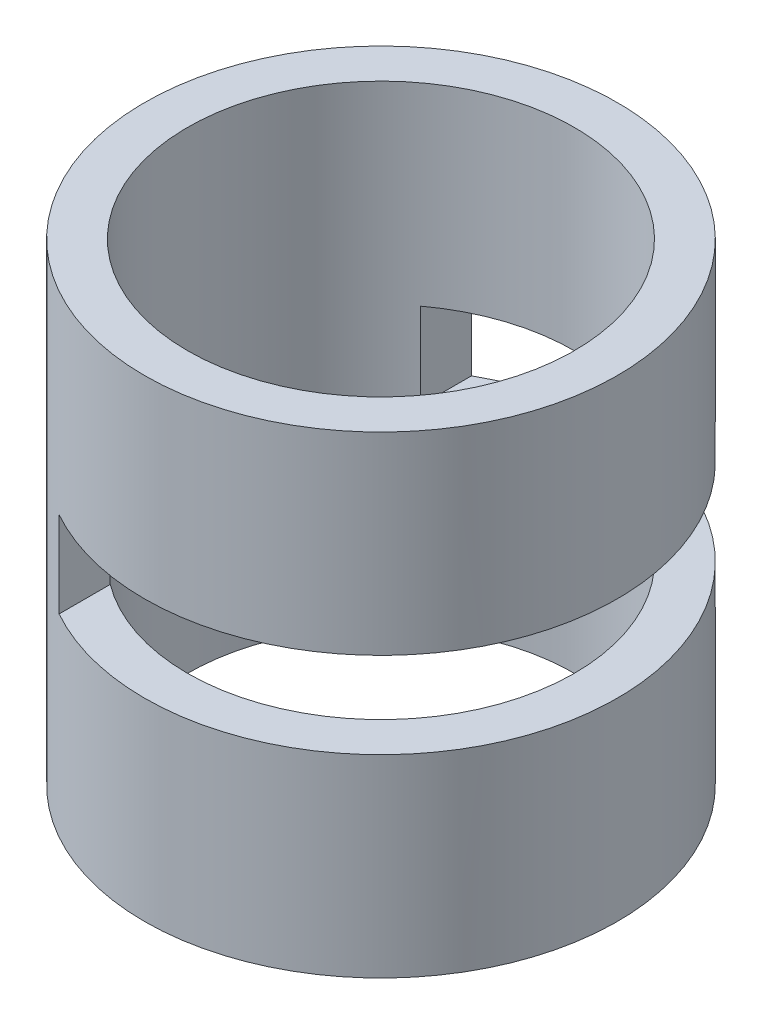
ISO-10303-21;
HEADER;
FILE_DESCRIPTION(('STEP AP214'),'2;1');
FILE_NAME('part.step','',(''),(''),'','','');
FILE_SCHEMA(('AUTOMOTIVE_DESIGN { 1 0 10303 214 1 1 1 1 }'));
ENDSEC;
DATA;
#1=APPLICATION_CONTEXT('core data for automotive mechanical design processes');
#2=APPLICATION_PROTOCOL_DEFINITION('international standard','automotive_design',2000,#1);
#3=PRODUCT_CONTEXT('',#1,'mechanical');
#4=PRODUCT('Part','Part','',(#3));
#5=PRODUCT_RELATED_PRODUCT_CATEGORY('part','',(#4));
#6=PRODUCT_DEFINITION_FORMATION('','',#4);
#7=PRODUCT_DEFINITION_CONTEXT('part definition',#1,'design');
#8=PRODUCT_DEFINITION('design','',#6,#7);
#9=PRODUCT_DEFINITION_SHAPE('','',#8);
#10=(LENGTH_UNIT() NAMED_UNIT(*) SI_UNIT(.MILLI.,.METRE.));
#11=(NAMED_UNIT(*) PLANE_ANGLE_UNIT() SI_UNIT($,.RADIAN.));
#12=(NAMED_UNIT(*) SI_UNIT($,.STERADIAN.) SOLID_ANGLE_UNIT());
#13=UNCERTAINTY_MEASURE_WITH_UNIT(LENGTH_MEASURE(1.E-05),#10,'distance_accuracy_value','');
#14=(GEOMETRIC_REPRESENTATION_CONTEXT(3) GLOBAL_UNCERTAINTY_ASSIGNED_CONTEXT((#13)) GLOBAL_UNIT_ASSIGNED_CONTEXT((#10,
#11,#12)) REPRESENTATION_CONTEXT('',''));
#15=CARTESIAN_POINT('',(0.,0.,0.));
#16=DIRECTION('',(0.,0.,1.));
#17=DIRECTION('',(1.,0.,0.));
#18=AXIS2_PLACEMENT_3D('',#15,#16,#17);
#19=CARTESIAN_POINT('',(0.,22.,0.));
#20=DIRECTION('',(0.,-1.,0.));
#21=DIRECTION('',(0.,0.,-1.));
#22=AXIS2_PLACEMENT_3D('',#19,#20,#21);
#23=CYLINDRICAL_SURFACE('',#22,11.);
#24=CARTESIAN_POINT('',(0.,0.,0.));
#25=DIRECTION('',(0.,1.,0.));
#26=DIRECTION('',(0.,0.,1.));
#27=AXIS2_PLACEMENT_3D('',#24,#25,#26);
#28=CIRCLE('',#27,11.);
#29=CARTESIAN_POINT('',(0.,0.,11.));
#30=VERTEX_POINT('',#29);
#31=EDGE_CURVE('E120',#30,#30,#28,.T.);
#32=ORIENTED_EDGE('',*,*,#31,.T.);
#33=EDGE_LOOP('',(#32));
#34=FACE_BOUND('',#33,.T.);
#35=CARTESIAN_POINT('',(0.,22.,0.));
#36=DIRECTION('',(0.,1.,0.));
#37=DIRECTION('',(0.,0.,1.));
#38=AXIS2_PLACEMENT_3D('',#35,#36,#37);
#39=CIRCLE('',#38,11.);
#40=CARTESIAN_POINT('',(0.,22.,11.));
#41=VERTEX_POINT('',#40);
#42=EDGE_CURVE('E122',#41,#41,#39,.T.);
#43=ORIENTED_EDGE('',*,*,#42,.F.);
#44=EDGE_LOOP('',(#43));
#45=FACE_BOUND('',#44,.T.);
#46=CARTESIAN_POINT('',(0.,13.,0.));
#47=DIRECTION('',(0.,-1.,0.));
#48=DIRECTION('',(0.,0.,-1.));
#49=AXIS2_PLACEMENT_3D('',#46,#47,#48);
#50=CIRCLE('',#49,11.);
#51=CARTESIAN_POINT('',(-5.38,13.,-9.59456095921017));
#52=VERTEX_POINT('',#51);
#53=CARTESIAN_POINT('',(-5.38,13.,9.59456095921017));
#54=VERTEX_POINT('',#53);
#55=EDGE_CURVE('E68',#52,#54,#50,.T.);
#56=ORIENTED_EDGE('',*,*,#55,.F.);
#57=DIRECTION('',(0.,-1.,0.));
#58=VECTOR('',#57,1.);
#59=CARTESIAN_POINT('',(-5.38,22.,-9.59456095921017));
#60=LINE('',#59,#58);
#61=CARTESIAN_POINT('',(-5.38,9.,-9.59456095921017));
#62=VERTEX_POINT('',#61);
#63=EDGE_CURVE('E100',#52,#62,#60,.T.);
#64=ORIENTED_EDGE('',*,*,#63,.T.);
#65=CARTESIAN_POINT('',(0.,9.,0.));
#66=DIRECTION('',(0.,-1.,0.));
#67=DIRECTION('',(0.,0.,-1.));
#68=AXIS2_PLACEMENT_3D('',#65,#66,#67);
#69=CIRCLE('',#68,11.);
#70=CARTESIAN_POINT('',(-5.38,9.,9.59456095921017));
#71=VERTEX_POINT('',#70);
#72=EDGE_CURVE('E85',#62,#71,#69,.T.);
#73=ORIENTED_EDGE('',*,*,#72,.T.);
#74=DIRECTION('',(0.,-1.,0.));
#75=VECTOR('',#74,1.);
#76=CARTESIAN_POINT('',(-5.38,22.,9.59456095921017));
#77=LINE('',#76,#75);
#78=EDGE_CURVE('E108',#71,#54,#77,.F.);
#79=ORIENTED_EDGE('',*,*,#78,.T.);
#80=EDGE_LOOP('',(#56,#64,#73,#79));
#81=FACE_BOUND('',#80,.T.);
#82=ADVANCED_FACE('F45',(#34,#45,#81),#23,.T.);
#83=CARTESIAN_POINT('',(0.,22.,0.));
#84=DIRECTION('',(0.,-1.,0.));
#85=DIRECTION('',(0.,0.,-1.));
#86=AXIS2_PLACEMENT_3D('',#83,#84,#85);
#87=CYLINDRICAL_SURFACE('',#86,9.);
#88=CARTESIAN_POINT('',(0.,22.,0.));
#89=DIRECTION('',(0.,1.,0.));
#90=DIRECTION('',(0.,0.,1.));
#91=AXIS2_PLACEMENT_3D('',#88,#89,#90);
#92=CIRCLE('',#91,9.);
#93=CARTESIAN_POINT('',(0.,22.,9.));
#94=VERTEX_POINT('',#93);
#95=EDGE_CURVE('E113',#94,#94,#92,.T.);
#96=ORIENTED_EDGE('',*,*,#95,.T.);
#97=EDGE_LOOP('',(#96));
#98=FACE_BOUND('',#97,.T.);
#99=CARTESIAN_POINT('',(0.,0.,0.));
#100=DIRECTION('',(0.,1.,0.));
#101=DIRECTION('',(0.,0.,1.));
#102=AXIS2_PLACEMENT_3D('',#99,#100,#101);
#103=CIRCLE('',#102,9.);
#104=CARTESIAN_POINT('',(0.,0.,9.));
#105=VERTEX_POINT('',#104);
#106=EDGE_CURVE('E107',#105,#105,#103,.T.);
#107=ORIENTED_EDGE('',*,*,#106,.F.);
#108=EDGE_LOOP('',(#107));
#109=FACE_BOUND('',#108,.T.);
#110=DIRECTION('',(0.,-1.,0.));
#111=VECTOR('',#110,1.);
#112=CARTESIAN_POINT('',(-5.38,22.,-7.21495668732668));
#113=LINE('',#112,#111);
#114=CARTESIAN_POINT('',(-5.38,13.,-7.21495668732668));
#115=VERTEX_POINT('',#114);
#116=CARTESIAN_POINT('',(-5.38,9.,-7.21495668732668));
#117=VERTEX_POINT('',#116);
#118=EDGE_CURVE('E53',#115,#117,#113,.T.);
#119=ORIENTED_EDGE('',*,*,#118,.F.);
#120=CARTESIAN_POINT('',(0.,13.,0.));
#121=DIRECTION('',(0.,-1.,0.));
#122=DIRECTION('',(0.,0.,-1.));
#123=AXIS2_PLACEMENT_3D('',#120,#121,#122);
#124=CIRCLE('',#123,9.);
#125=CARTESIAN_POINT('',(-5.38,13.,7.21495668732668));
#126=VERTEX_POINT('',#125);
#127=EDGE_CURVE('E11',#115,#126,#124,.T.);
#128=ORIENTED_EDGE('',*,*,#127,.T.);
#129=DIRECTION('',(0.,-1.,0.));
#130=VECTOR('',#129,1.);
#131=CARTESIAN_POINT('',(-5.38,22.,7.21495668732668));
#132=LINE('',#131,#130);
#133=CARTESIAN_POINT('',(-5.38,9.,7.21495668732668));
#134=VERTEX_POINT('',#133);
#135=EDGE_CURVE('E132',#134,#126,#132,.F.);
#136=ORIENTED_EDGE('',*,*,#135,.F.);
#137=CARTESIAN_POINT('',(0.,9.,0.));
#138=DIRECTION('',(0.,-1.,0.));
#139=DIRECTION('',(0.,0.,-1.));
#140=AXIS2_PLACEMENT_3D('',#137,#138,#139);
#141=CIRCLE('',#140,9.);
#142=EDGE_CURVE('E126',#117,#134,#141,.T.);
#143=ORIENTED_EDGE('',*,*,#142,.F.);
#144=EDGE_LOOP('',(#119,#128,#136,#143));
#145=FACE_BOUND('',#144,.T.);
#146=ADVANCED_FACE('F142',(#98,#109,#145),#87,.F.);
#147=CARTESIAN_POINT('',(0.,22.,0.));
#148=DIRECTION('',(0.,1.,0.));
#149=DIRECTION('',(0.,0.,1.));
#150=AXIS2_PLACEMENT_3D('',#147,#148,#149);
#151=PLANE('',#150);
#152=ORIENTED_EDGE('',*,*,#42,.T.);
#153=EDGE_LOOP('',(#152));
#154=FACE_BOUND('',#153,.T.);
#155=ORIENTED_EDGE('',*,*,#95,.F.);
#156=EDGE_LOOP('',(#155));
#157=FACE_BOUND('',#156,.T.);
#158=ADVANCED_FACE('F144',(#154,#157),#151,.T.);
#159=CARTESIAN_POINT('',(0.,0.,0.));
#160=DIRECTION('',(0.,1.,0.));
#161=DIRECTION('',(0.,0.,1.));
#162=AXIS2_PLACEMENT_3D('',#159,#160,#161);
#163=PLANE('',#162);
#164=ORIENTED_EDGE('',*,*,#31,.F.);
#165=EDGE_LOOP('',(#164));
#166=FACE_BOUND('',#165,.T.);
#167=ORIENTED_EDGE('',*,*,#106,.T.);
#168=EDGE_LOOP('',(#167));
#169=FACE_BOUND('',#168,.T.);
#170=ADVANCED_FACE('F152',(#166,#169),#163,.F.);
#171=CARTESIAN_POINT('',(-5.38,13.,-11.));
#172=DIRECTION('',(-1.,0.,0.));
#173=DIRECTION('',(0.,-1.,0.));
#174=AXIS2_PLACEMENT_3D('',#171,#172,#173);
#175=PLANE('',#174);
#176=DIRECTION('',(0.,0.,1.));
#177=VECTOR('',#176,1.);
#178=CARTESIAN_POINT('',(-5.38,13.,-11.));
#179=LINE('',#178,#177);
#180=EDGE_CURVE('E94',#52,#115,#179,.T.);
#181=ORIENTED_EDGE('',*,*,#180,.T.);
#182=ORIENTED_EDGE('',*,*,#118,.T.);
#183=DIRECTION('',(0.,0.,1.));
#184=VECTOR('',#183,1.);
#185=CARTESIAN_POINT('',(-5.38,9.,-11.));
#186=LINE('',#185,#184);
#187=EDGE_CURVE('E60',#62,#117,#186,.T.);
#188=ORIENTED_EDGE('',*,*,#187,.F.);
#189=ORIENTED_EDGE('',*,*,#63,.F.);
#190=EDGE_LOOP('',(#181,#182,#188,#189));
#191=FACE_BOUND('',#190,.T.);
#192=ADVANCED_FACE('F99',(#191),#175,.F.);
#193=EDGE_CURVE('E88',#134,#71,#186,.T.);
#194=ORIENTED_EDGE('',*,*,#193,.F.);
#195=ORIENTED_EDGE('',*,*,#135,.T.);
#196=EDGE_CURVE('E104',#126,#54,#179,.T.);
#197=ORIENTED_EDGE('',*,*,#196,.T.);
#198=ORIENTED_EDGE('',*,*,#78,.F.);
#199=EDGE_LOOP('',(#194,#195,#197,#198));
#200=FACE_BOUND('',#199,.T.);
#201=ADVANCED_FACE('F137',(#200),#175,.F.);
#202=CARTESIAN_POINT('',(-5.38,13.,-11.));
#203=DIRECTION('',(0.,-1.,0.));
#204=DIRECTION('',(0.,0.,-1.));
#205=AXIS2_PLACEMENT_3D('',#202,#203,#204);
#206=PLANE('',#205);
#207=ORIENTED_EDGE('',*,*,#55,.T.);
#208=ORIENTED_EDGE('',*,*,#196,.F.);
#209=ORIENTED_EDGE('',*,*,#127,.F.);
#210=ORIENTED_EDGE('',*,*,#180,.F.);
#211=EDGE_LOOP('',(#207,#208,#209,#210));
#212=FACE_BOUND('',#211,.T.);
#213=ADVANCED_FACE('F139',(#212),#206,.T.);
#214=CARTESIAN_POINT('',(-5.38,9.,-11.));
#215=DIRECTION('',(0.,-1.,0.));
#216=DIRECTION('',(0.,0.,-1.));
#217=AXIS2_PLACEMENT_3D('',#214,#215,#216);
#218=PLANE('',#217);
#219=ORIENTED_EDGE('',*,*,#72,.F.);
#220=ORIENTED_EDGE('',*,*,#187,.T.);
#221=ORIENTED_EDGE('',*,*,#142,.T.);
#222=ORIENTED_EDGE('',*,*,#193,.T.);
#223=EDGE_LOOP('',(#219,#220,#221,#222));
#224=FACE_BOUND('',#223,.T.);
#225=ADVANCED_FACE('F86',(#224),#218,.F.);
#226=CLOSED_SHELL('',(#82,#146,#158,#170,#192,#201,#213,#225));
#227=MANIFOLD_SOLID_BREP('B2',#226);
#228=ADVANCED_BREP_SHAPE_REPRESENTATION('',(#18,#227),#14);
#229=SHAPE_DEFINITION_REPRESENTATION(#9,#228);
ENDSEC;
END-ISO-10303-21;
